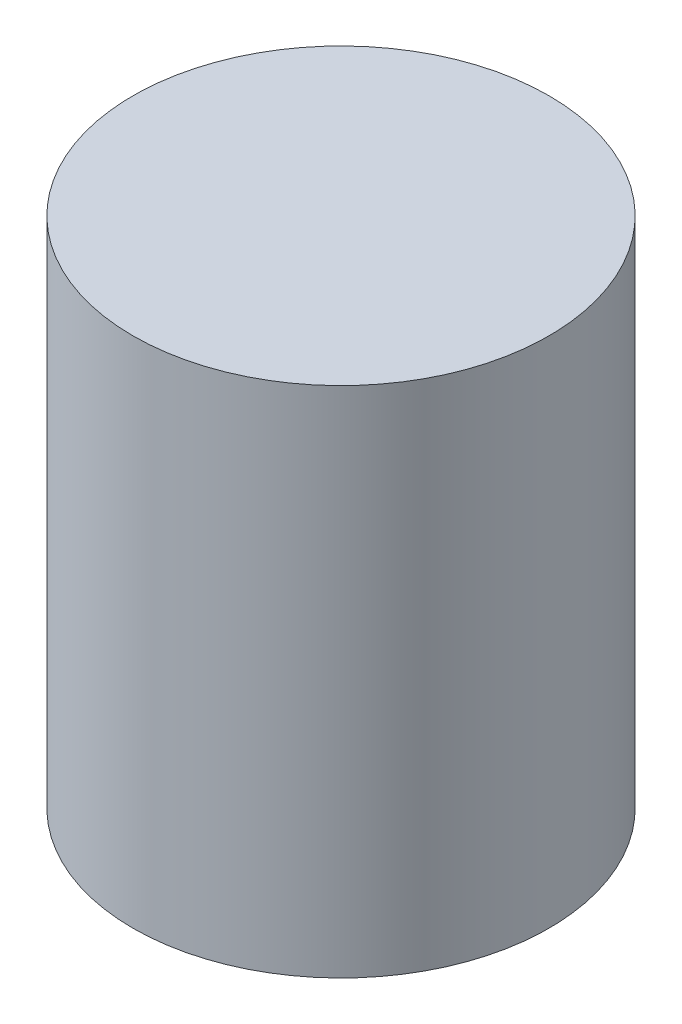
ISO-10303-21;
HEADER;
FILE_DESCRIPTION(('STEP AP214'),'2;1');
FILE_NAME('part.step','',(''),(''),'','','');
FILE_SCHEMA(('AUTOMOTIVE_DESIGN { 1 0 10303 214 1 1 1 1 }'));
ENDSEC;
DATA;
#1=APPLICATION_CONTEXT('core data for automotive mechanical design processes');
#2=APPLICATION_PROTOCOL_DEFINITION('international standard','automotive_design',2000,#1);
#3=PRODUCT_CONTEXT('',#1,'mechanical');
#4=PRODUCT('Part','Part','',(#3));
#5=PRODUCT_RELATED_PRODUCT_CATEGORY('part','',(#4));
#6=PRODUCT_DEFINITION_FORMATION('','',#4);
#7=PRODUCT_DEFINITION_CONTEXT('part definition',#1,'design');
#8=PRODUCT_DEFINITION('design','',#6,#7);
#9=PRODUCT_DEFINITION_SHAPE('','',#8);
#10=(LENGTH_UNIT() NAMED_UNIT(*) SI_UNIT(.MILLI.,.METRE.));
#11=(NAMED_UNIT(*) PLANE_ANGLE_UNIT() SI_UNIT($,.RADIAN.));
#12=(NAMED_UNIT(*) SI_UNIT($,.STERADIAN.) SOLID_ANGLE_UNIT());
#13=UNCERTAINTY_MEASURE_WITH_UNIT(LENGTH_MEASURE(1.E-05),#10,'distance_accuracy_value','');
#14=(GEOMETRIC_REPRESENTATION_CONTEXT(3) GLOBAL_UNCERTAINTY_ASSIGNED_CONTEXT((#13)) GLOBAL_UNIT_ASSIGNED_CONTEXT((#10,
#11,#12)) REPRESENTATION_CONTEXT('',''));
#15=CARTESIAN_POINT('',(0.,0.,0.));
#16=DIRECTION('',(0.,0.,1.));
#17=DIRECTION('',(1.,0.,0.));
#18=AXIS2_PLACEMENT_3D('',#15,#16,#17);
#19=CARTESIAN_POINT('',(0.,18.5,0.));
#20=DIRECTION('',(0.,-1.,0.));
#21=DIRECTION('',(0.,0.,-1.));
#22=AXIS2_PLACEMENT_3D('',#19,#20,#21);
#23=CYLINDRICAL_SURFACE('',#22,7.5);
#24=CARTESIAN_POINT('',(0.,18.5,0.));
#25=DIRECTION('',(0.,1.,0.));
#26=DIRECTION('',(0.,0.,1.));
#27=AXIS2_PLACEMENT_3D('',#24,#25,#26);
#28=CIRCLE('',#27,7.5);
#29=CARTESIAN_POINT('',(0.,18.5,7.5));
#30=VERTEX_POINT('',#29);
#31=EDGE_CURVE('E10',#30,#30,#28,.T.);
#32=ORIENTED_EDGE('',*,*,#31,.F.);
#33=EDGE_LOOP('',(#32));
#34=FACE_BOUND('',#33,.T.);
#35=CARTESIAN_POINT('',(0.,0.,0.));
#36=DIRECTION('',(0.,1.,0.));
#37=DIRECTION('',(0.,0.,1.));
#38=AXIS2_PLACEMENT_3D('',#35,#36,#37);
#39=CIRCLE('',#38,7.5);
#40=CARTESIAN_POINT('',(0.,0.,7.5));
#41=VERTEX_POINT('',#40);
#42=EDGE_CURVE('E34',#41,#41,#39,.T.);
#43=ORIENTED_EDGE('',*,*,#42,.T.);
#44=EDGE_LOOP('',(#43));
#45=FACE_BOUND('',#44,.T.);
#46=ADVANCED_FACE('F31',(#34,#45),#23,.T.);
#47=CARTESIAN_POINT('',(0.,18.5,0.));
#48=DIRECTION('',(0.,1.,0.));
#49=DIRECTION('',(0.,0.,1.));
#50=AXIS2_PLACEMENT_3D('',#47,#48,#49);
#51=PLANE('',#50);
#52=ORIENTED_EDGE('',*,*,#31,.T.);
#53=EDGE_LOOP('',(#52));
#54=FACE_BOUND('',#53,.T.);
#55=ADVANCED_FACE('F46',(#54),#51,.T.);
#56=CARTESIAN_POINT('',(0.,0.,0.));
#57=DIRECTION('',(0.,1.,0.));
#58=DIRECTION('',(0.,0.,1.));
#59=AXIS2_PLACEMENT_3D('',#56,#57,#58);
#60=PLANE('',#59);
#61=ORIENTED_EDGE('',*,*,#42,.F.);
#62=EDGE_LOOP('',(#61));
#63=FACE_BOUND('',#62,.T.);
#64=ADVANCED_FACE('F44',(#63),#60,.F.);
#65=CLOSED_SHELL('',(#46,#55,#64));
#66=MANIFOLD_SOLID_BREP('B2',#65);
#67=ADVANCED_BREP_SHAPE_REPRESENTATION('',(#18,#66),#14);
#68=SHAPE_DEFINITION_REPRESENTATION(#9,#67);
ENDSEC;
END-ISO-10303-21;
